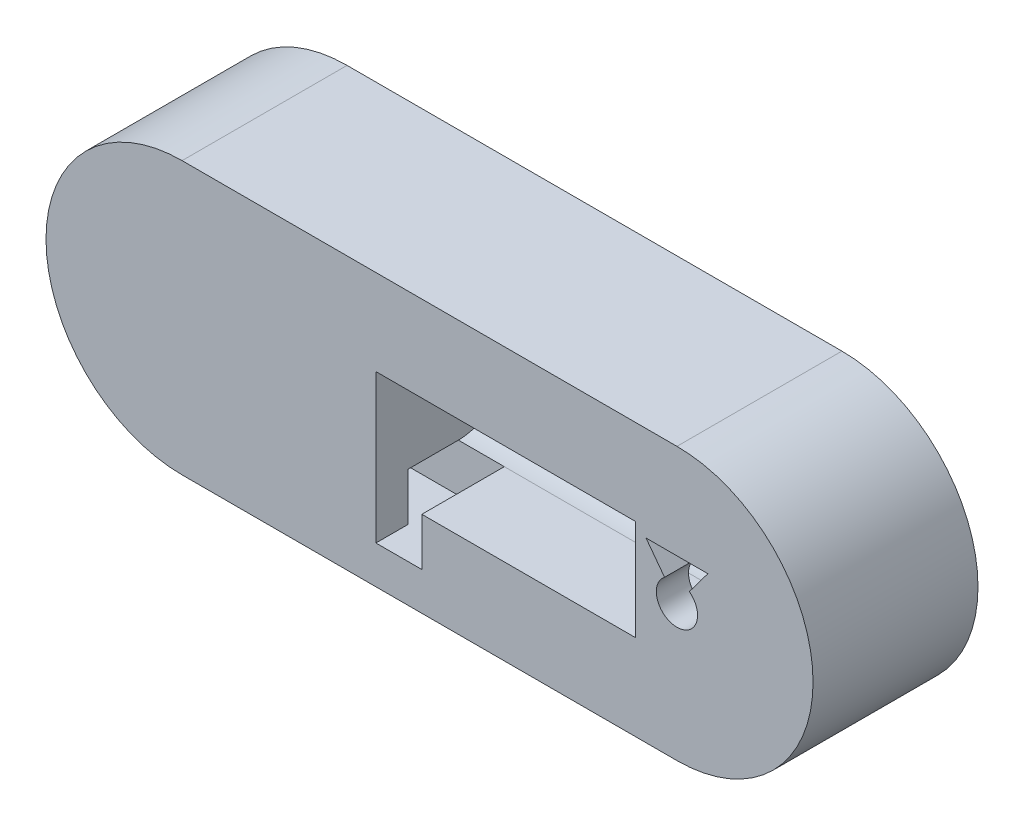
ISO-10303-21;
HEADER;
FILE_DESCRIPTION(('STEP AP214'),'2;1');
FILE_NAME('part.step','',(''),(''),'','','');
FILE_SCHEMA(('AUTOMOTIVE_DESIGN { 1 0 10303 214 1 1 1 1 }'));
ENDSEC;
DATA;
#1=APPLICATION_CONTEXT('core data for automotive mechanical design processes');
#2=APPLICATION_PROTOCOL_DEFINITION('international standard','automotive_design',2000,#1);
#3=PRODUCT_CONTEXT('',#1,'mechanical');
#4=PRODUCT('Part','Part','',(#3));
#5=PRODUCT_RELATED_PRODUCT_CATEGORY('part','',(#4));
#6=PRODUCT_DEFINITION_FORMATION('','',#4);
#7=PRODUCT_DEFINITION_CONTEXT('part definition',#1,'design');
#8=PRODUCT_DEFINITION('design','',#6,#7);
#9=PRODUCT_DEFINITION_SHAPE('','',#8);
#10=(LENGTH_UNIT() NAMED_UNIT(*) SI_UNIT(.MILLI.,.METRE.));
#11=(NAMED_UNIT(*) PLANE_ANGLE_UNIT() SI_UNIT($,.RADIAN.));
#12=(NAMED_UNIT(*) SI_UNIT($,.STERADIAN.) SOLID_ANGLE_UNIT());
#13=UNCERTAINTY_MEASURE_WITH_UNIT(LENGTH_MEASURE(1.E-05),#10,'distance_accuracy_value','');
#14=(GEOMETRIC_REPRESENTATION_CONTEXT(3) GLOBAL_UNCERTAINTY_ASSIGNED_CONTEXT((#13)) GLOBAL_UNIT_ASSIGNED_CONTEXT((#10,
#11,#12)) REPRESENTATION_CONTEXT('',''));
#15=CARTESIAN_POINT('',(0.,0.,0.));
#16=DIRECTION('',(0.,0.,1.));
#17=DIRECTION('',(1.,0.,0.));
#18=AXIS2_PLACEMENT_3D('',#15,#16,#17);
#19=CARTESIAN_POINT('',(3.97288903810641,0.,20.));
#20=DIRECTION('',(-1.,0.,0.));
#21=DIRECTION('',(0.,-1.,0.));
#22=AXIS2_PLACEMENT_3D('',#19,#20,#21);
#23=PLANE('',#22);
#24=DIRECTION('',(0.,0.,1.));
#25=VECTOR('',#24,1.);
#26=CARTESIAN_POINT('',(3.97288903810642,-12.2,0.));
#27=LINE('',#26,#25);
#28=CARTESIAN_POINT('',(3.97288903810642,-12.2,20.));
#29=VERTEX_POINT('',#28);
#30=CARTESIAN_POINT('',(3.97288903810642,-12.2,32.2));
#31=VERTEX_POINT('',#30);
#32=EDGE_CURVE('E260',#29,#31,#27,.T.);
#33=ORIENTED_EDGE('',*,*,#32,.F.);
#34=CARTESIAN_POINT('',(3.97288903810641,0.,20.));
#35=DIRECTION('',(1.,0.,0.));
#36=DIRECTION('',(0.,1.,0.));
#37=AXIS2_PLACEMENT_3D('',#34,#35,#36);
#38=CIRCLE('',#37,12.2);
#39=CARTESIAN_POINT('',(3.97288903810641,12.2,20.));
#40=VERTEX_POINT('',#39);
#41=EDGE_CURVE('E331',#29,#40,#38,.T.);
#42=ORIENTED_EDGE('',*,*,#41,.T.);
#43=DIRECTION('',(0.,0.,1.));
#44=VECTOR('',#43,1.);
#45=CARTESIAN_POINT('',(3.97288903810641,12.2,20.));
#46=LINE('',#45,#44);
#47=CARTESIAN_POINT('',(3.97288903810641,12.2,40.));
#48=VERTEX_POINT('',#47);
#49=EDGE_CURVE('E377',#40,#48,#46,.T.);
#50=ORIENTED_EDGE('',*,*,#49,.T.);
#51=DIRECTION('',(0.,-1.,0.));
#52=VECTOR('',#51,1.);
#53=CARTESIAN_POINT('',(3.97288903810641,0.,40.));
#54=LINE('',#53,#52);
#55=CARTESIAN_POINT('',(3.97288903810642,-23.8,40.));
#56=VERTEX_POINT('',#55);
#57=EDGE_CURVE('E356',#48,#56,#54,.T.);
#58=ORIENTED_EDGE('',*,*,#57,.T.);
#59=DIRECTION('',(0.,0.,1.));
#60=VECTOR('',#59,1.);
#61=CARTESIAN_POINT('',(3.97288903810642,-23.8,20.));
#62=LINE('',#61,#60);
#63=CARTESIAN_POINT('',(3.97288903810642,-23.8,32.2));
#64=VERTEX_POINT('',#63);
#65=EDGE_CURVE('E376',#64,#56,#62,.T.);
#66=ORIENTED_EDGE('',*,*,#65,.F.);
#67=DIRECTION('',(0.,-1.,0.));
#68=VECTOR('',#67,1.);
#69=CARTESIAN_POINT('',(3.97288903810641,0.,32.2));
#70=LINE('',#69,#68);
#71=EDGE_CURVE('E486',#31,#64,#70,.T.);
#72=ORIENTED_EDGE('',*,*,#71,.F.);
#73=EDGE_LOOP('',(#33,#42,#50,#58,#66,#72));
#74=FACE_BOUND('',#73,.T.);
#75=ADVANCED_FACE('F51',(#74),#23,.F.);
#76=CARTESIAN_POINT('',(76.9728890381064,0.,40.));
#77=DIRECTION('',(0.,0.,-1.));
#78=DIRECTION('',(-1.,0.,0.));
#79=AXIS2_PLACEMENT_3D('',#76,#77,#78);
#80=CYLINDRICAL_SURFACE('',#79,5.);
#81=DIRECTION('',(0.,0.,-1.));
#82=VECTOR('',#81,1.);
#83=CARTESIAN_POINT('',(73.9728890381064,4.,40.));
#84=LINE('',#83,#82);
#85=CARTESIAN_POINT('',(73.9728890381064,4.,7.80000000000001));
#86=VERTEX_POINT('',#85);
#87=CARTESIAN_POINT('',(73.9728890381064,4.,0.));
#88=VERTEX_POINT('',#87);
#89=EDGE_CURVE('E454',#86,#88,#84,.T.);
#90=ORIENTED_EDGE('',*,*,#89,.F.);
#91=CARTESIAN_POINT('',(76.9728890381064,0.,7.80000000000001));
#92=DIRECTION('',(0.,0.,1.));
#93=DIRECTION('',(1.,0.,0.));
#94=AXIS2_PLACEMENT_3D('',#91,#92,#93);
#95=CIRCLE('',#94,5.);
#96=CARTESIAN_POINT('',(79.9728890381064,4.,7.80000000000001));
#97=VERTEX_POINT('',#96);
#98=EDGE_CURVE('E325',#86,#97,#95,.T.);
#99=ORIENTED_EDGE('',*,*,#98,.T.);
#100=DIRECTION('',(0.,0.,-1.));
#101=VECTOR('',#100,1.);
#102=CARTESIAN_POINT('',(79.9728890381064,4.,40.));
#103=LINE('',#102,#101);
#104=CARTESIAN_POINT('',(79.9728890381064,4.,0.));
#105=VERTEX_POINT('',#104);
#106=EDGE_CURVE('E444',#97,#105,#103,.T.);
#107=ORIENTED_EDGE('',*,*,#106,.T.);
#108=CARTESIAN_POINT('',(76.9728890381064,0.,0.));
#109=DIRECTION('',(0.,0.,1.));
#110=DIRECTION('',(1.,0.,0.));
#111=AXIS2_PLACEMENT_3D('',#108,#109,#110);
#112=CIRCLE('',#111,5.);
#113=EDGE_CURVE('E427',#88,#105,#112,.T.);
#114=ORIENTED_EDGE('',*,*,#113,.F.);
#115=EDGE_LOOP('',(#90,#99,#107,#114));
#116=FACE_BOUND('',#115,.T.);
#117=ADVANCED_FACE('F557',(#116),#80,.F.);
#118=CARTESIAN_POINT('',(49.2626489843882,36.9469867382911,40.));
#119=DIRECTION('',(0.800000000000001,0.599999999999999,0.));
#120=DIRECTION('',(-0.599999999999999,0.800000000000001,0.));
#121=AXIS2_PLACEMENT_3D('',#118,#119,#120);
#122=PLANE('',#121);
#123=DIRECTION('',(0.,0.,-1.));
#124=VECTOR('',#123,1.);
#125=CARTESIAN_POINT('',(69.4728890381064,9.99999999999999,40.));
#126=LINE('',#125,#124);
#127=CARTESIAN_POINT('',(69.4728890381064,10.,7.80000000000001));
#128=VERTEX_POINT('',#127);
#129=CARTESIAN_POINT('',(69.4728890381064,9.99999999999999,0.));
#130=VERTEX_POINT('',#129);
#131=EDGE_CURVE('E446',#128,#130,#126,.T.);
#132=ORIENTED_EDGE('',*,*,#131,.F.);
#133=DIRECTION('',(0.599999999999999,-0.800000000000001,0.));
#134=VECTOR('',#133,1.);
#135=CARTESIAN_POINT('',(49.2626489843882,36.9469867382911,7.80000000000001));
#136=LINE('',#135,#134);
#137=EDGE_CURVE('E322',#128,#86,#136,.T.);
#138=ORIENTED_EDGE('',*,*,#137,.T.);
#139=ORIENTED_EDGE('',*,*,#89,.T.);
#140=DIRECTION('',(0.599999999999999,-0.800000000000001,0.));
#141=VECTOR('',#140,1.);
#142=CARTESIAN_POINT('',(49.2626489843882,36.9469867382911,0.));
#143=LINE('',#142,#141);
#144=EDGE_CURVE('E433',#130,#88,#143,.T.);
#145=ORIENTED_EDGE('',*,*,#144,.F.);
#146=EDGE_LOOP('',(#132,#138,#139,#145));
#147=FACE_BOUND('',#146,.T.);
#148=ADVANCED_FACE('F566',(#147),#122,.T.);
#149=CARTESIAN_POINT('',(0.,10.,40.));
#150=DIRECTION('',(0.,-1.,0.));
#151=DIRECTION('',(0.,0.,-1.));
#152=AXIS2_PLACEMENT_3D('',#149,#150,#151);
#153=PLANE('',#152);
#154=DIRECTION('',(0.,0.,-1.));
#155=VECTOR('',#154,1.);
#156=CARTESIAN_POINT('',(84.4728890381064,9.99999999999999,40.));
#157=LINE('',#156,#155);
#158=CARTESIAN_POINT('',(84.4728890381064,9.99999999999999,7.80000000000001));
#159=VERTEX_POINT('',#158);
#160=CARTESIAN_POINT('',(84.4728890381064,9.99999999999999,0.));
#161=VERTEX_POINT('',#160);
#162=EDGE_CURVE('E443',#159,#161,#157,.T.);
#163=ORIENTED_EDGE('',*,*,#162,.F.);
#164=DIRECTION('',(-1.,0.,0.));
#165=VECTOR('',#164,1.);
#166=CARTESIAN_POINT('',(0.,10.,7.80000000000001));
#167=LINE('',#166,#165);
#168=EDGE_CURVE('E316',#159,#128,#167,.T.);
#169=ORIENTED_EDGE('',*,*,#168,.T.);
#170=ORIENTED_EDGE('',*,*,#131,.T.);
#171=DIRECTION('',(-1.,0.,0.));
#172=VECTOR('',#171,1.);
#173=CARTESIAN_POINT('',(0.,10.,0.));
#174=LINE('',#173,#172);
#175=EDGE_CURVE('E436',#161,#130,#174,.T.);
#176=ORIENTED_EDGE('',*,*,#175,.F.);
#177=EDGE_LOOP('',(#163,#169,#170,#176));
#178=FACE_BOUND('',#177,.T.);
#179=ADVANCED_FACE('F603',(#178),#153,.T.);
#180=CARTESIAN_POINT('',(49.2626489843881,-36.9469867382911,40.));
#181=DIRECTION('',(-0.8,0.6,0.));
#182=DIRECTION('',(-0.6,-0.8,0.));
#183=AXIS2_PLACEMENT_3D('',#180,#181,#182);
#184=PLANE('',#183);
#185=ORIENTED_EDGE('',*,*,#106,.F.);
#186=DIRECTION('',(0.6,0.8,0.));
#187=VECTOR('',#186,1.);
#188=CARTESIAN_POINT('',(49.2626489843881,-36.9469867382911,7.80000000000001));
#189=LINE('',#188,#187);
#190=EDGE_CURVE('E309',#97,#159,#189,.T.);
#191=ORIENTED_EDGE('',*,*,#190,.T.);
#192=ORIENTED_EDGE('',*,*,#162,.T.);
#193=DIRECTION('',(0.6,0.8,0.));
#194=VECTOR('',#193,1.);
#195=CARTESIAN_POINT('',(49.2626489843881,-36.9469867382911,0.));
#196=LINE('',#195,#194);
#197=EDGE_CURVE('E396',#105,#161,#196,.T.);
#198=ORIENTED_EDGE('',*,*,#197,.F.);
#199=EDGE_LOOP('',(#185,#191,#192,#198));
#200=FACE_BOUND('',#199,.T.);
#201=ADVANCED_FACE('F577',(#200),#184,.T.);
#202=CARTESIAN_POINT('',(66.9728890381064,0.,20.));
#203=DIRECTION('',(1.,0.,0.));
#204=DIRECTION('',(0.,0.,-1.));
#205=AXIS2_PLACEMENT_3D('',#202,#203,#204);
#206=PLANE('',#205);
#207=DIRECTION('',(0.,1.,0.));
#208=VECTOR('',#207,1.);
#209=CARTESIAN_POINT('',(66.9728890381064,0.,32.2));
#210=LINE('',#209,#208);
#211=CARTESIAN_POINT('',(66.9728890381064,-12.2,32.2));
#212=VERTEX_POINT('',#211);
#213=CARTESIAN_POINT('',(66.9728890381064,12.2,32.2));
#214=VERTEX_POINT('',#213);
#215=EDGE_CURVE('E299',#212,#214,#210,.T.);
#216=ORIENTED_EDGE('',*,*,#215,.F.);
#217=DIRECTION('',(0.,0.,1.));
#218=VECTOR('',#217,1.);
#219=CARTESIAN_POINT('',(66.9728890381064,-12.2,20.));
#220=LINE('',#219,#218);
#221=CARTESIAN_POINT('',(66.9728890381064,-12.2,40.));
#222=VERTEX_POINT('',#221);
#223=EDGE_CURVE('E367',#212,#222,#220,.T.);
#224=ORIENTED_EDGE('',*,*,#223,.T.);
#225=DIRECTION('',(0.,1.,0.));
#226=VECTOR('',#225,1.);
#227=CARTESIAN_POINT('',(66.9728890381064,0.,40.));
#228=LINE('',#227,#226);
#229=CARTESIAN_POINT('',(66.9728890381064,12.2,40.));
#230=VERTEX_POINT('',#229);
#231=EDGE_CURVE('E336',#222,#230,#228,.T.);
#232=ORIENTED_EDGE('',*,*,#231,.T.);
#233=DIRECTION('',(0.,0.,1.));
#234=VECTOR('',#233,1.);
#235=CARTESIAN_POINT('',(66.9728890381064,12.2,20.));
#236=LINE('',#235,#234);
#237=EDGE_CURVE('E355',#214,#230,#236,.T.);
#238=ORIENTED_EDGE('',*,*,#237,.F.);
#239=EDGE_LOOP('',(#216,#224,#232,#238));
#240=FACE_BOUND('',#239,.T.);
#241=ADVANCED_FACE('F526',(#240),#206,.F.);
#242=CARTESIAN_POINT('',(0.,0.,20.));
#243=DIRECTION('',(0.,0.,1.));
#244=DIRECTION('',(1.,0.,0.));
#245=AXIS2_PLACEMENT_3D('',#242,#243,#244);
#246=PLANE('',#245);
#247=DIRECTION('',(0.,1.,0.));
#248=VECTOR('',#247,1.);
#249=CARTESIAN_POINT('',(-34.4271109618936,0.,20.));
#250=LINE('',#249,#248);
#251=CARTESIAN_POINT('',(-34.4271109618936,-23.8,20.));
#252=VERTEX_POINT('',#251);
#253=CARTESIAN_POINT('',(-34.4271109618936,-12.2,20.));
#254=VERTEX_POINT('',#253);
#255=EDGE_CURVE('E252',#252,#254,#250,.T.);
#256=ORIENTED_EDGE('',*,*,#255,.F.);
#257=DIRECTION('',(1.,0.,0.));
#258=VECTOR('',#257,1.);
#259=CARTESIAN_POINT('',(0.,-23.8,20.));
#260=LINE('',#259,#258);
#261=CARTESIAN_POINT('',(15.1104475181307,-23.8,20.));
#262=VERTEX_POINT('',#261);
#263=EDGE_CURVE('E343',#252,#262,#260,.T.);
#264=ORIENTED_EDGE('',*,*,#263,.T.);
#265=DIRECTION('',(0.,1.,0.));
#266=VECTOR('',#265,1.);
#267=CARTESIAN_POINT('',(15.1104475181307,0.,20.));
#268=LINE('',#267,#266);
#269=CARTESIAN_POINT('',(15.1104475181307,-12.2,20.));
#270=VERTEX_POINT('',#269);
#271=EDGE_CURVE('E350',#262,#270,#268,.T.);
#272=ORIENTED_EDGE('',*,*,#271,.T.);
#273=DIRECTION('',(-1.,0.,0.));
#274=VECTOR('',#273,1.);
#275=CARTESIAN_POINT('',(107.373384084578,-12.2,20.));
#276=LINE('',#275,#274);
#277=EDGE_CURVE('E272',#270,#29,#276,.T.);
#278=ORIENTED_EDGE('',*,*,#277,.T.);
#279=DIRECTION('',(1.,0.,0.));
#280=VECTOR('',#279,1.);
#281=CARTESIAN_POINT('',(-46.0271109618936,-12.2,20.));
#282=LINE('',#281,#280);
#283=EDGE_CURVE('E261',#254,#29,#282,.T.);
#284=ORIENTED_EDGE('',*,*,#283,.F.);
#285=EDGE_LOOP('',(#256,#264,#272,#278,#284));
#286=FACE_BOUND('',#285,.T.);
#287=ADVANCED_FACE('F269',(#286),#246,.T.);
#288=CARTESIAN_POINT('',(0.,0.,0.));
#289=DIRECTION('',(0.,0.,1.));
#290=DIRECTION('',(1.,0.,0.));
#291=AXIS2_PLACEMENT_3D('',#288,#289,#290);
#292=PLANE('',#291);
#293=DIRECTION('',(1.,0.,0.));
#294=VECTOR('',#293,1.);
#295=CARTESIAN_POINT('',(0.,-12.2,0.));
#296=LINE('',#295,#294);
#297=CARTESIAN_POINT('',(-56.0271109618936,-12.2,0.));
#298=VERTEX_POINT('',#297);
#299=CARTESIAN_POINT('',(-34.4271109618936,-12.2,0.));
#300=VERTEX_POINT('',#299);
#301=EDGE_CURVE('E70',#298,#300,#296,.T.);
#302=ORIENTED_EDGE('',*,*,#301,.F.);
#303=DIRECTION('',(0.,-1.,0.));
#304=VECTOR('',#303,1.);
#305=CARTESIAN_POINT('',(-56.0271109618936,-23.8,0.));
#306=LINE('',#305,#304);
#307=CARTESIAN_POINT('',(-56.0271109618936,-23.8,0.));
#308=VERTEX_POINT('',#307);
#309=EDGE_CURVE('E472',#298,#308,#306,.T.);
#310=ORIENTED_EDGE('',*,*,#309,.T.);
#311=DIRECTION('',(-1.,0.,0.));
#312=VECTOR('',#311,1.);
#313=CARTESIAN_POINT('',(0.,-23.7999999999999,0.));
#314=LINE('',#313,#312);
#315=CARTESIAN_POINT('',(-34.4271109618936,-23.8,0.));
#316=VERTEX_POINT('',#315);
#317=EDGE_CURVE('E74',#316,#308,#314,.T.);
#318=ORIENTED_EDGE('',*,*,#317,.F.);
#319=DIRECTION('',(0.,1.,0.));
#320=VECTOR('',#319,1.);
#321=CARTESIAN_POINT('',(-34.4271109618936,0.,0.));
#322=LINE('',#321,#320);
#323=EDGE_CURVE('E267',#316,#300,#322,.T.);
#324=ORIENTED_EDGE('',*,*,#323,.T.);
#325=EDGE_LOOP('',(#302,#310,#318,#324));
#326=FACE_BOUND('',#325,.T.);
#327=CARTESIAN_POINT('',(-43.0271109618936,0.,0.));
#328=DIRECTION('',(0.,0.,1.));
#329=DIRECTION('',(1.,0.,0.));
#330=AXIS2_PLACEMENT_3D('',#327,#328,#329);
#331=CIRCLE('',#330,33.);
#332=CARTESIAN_POINT('',(-43.0271109618936,33.,0.));
#333=VERTEX_POINT('',#332);
#334=CARTESIAN_POINT('',(-43.0271109618936,-33.,0.));
#335=VERTEX_POINT('',#334);
#336=EDGE_CURVE('E393',#333,#335,#331,.T.);
#337=ORIENTED_EDGE('',*,*,#336,.F.);
#338=DIRECTION('',(1.,0.,0.));
#339=VECTOR('',#338,1.);
#340=CARTESIAN_POINT('',(0.,33.,0.));
#341=LINE('',#340,#339);
#342=CARTESIAN_POINT('',(76.9728890381064,33.,0.));
#343=VERTEX_POINT('',#342);
#344=EDGE_CURVE('E430',#333,#343,#341,.T.);
#345=ORIENTED_EDGE('',*,*,#344,.T.);
#346=CARTESIAN_POINT('',(76.9728890381064,0.,0.));
#347=DIRECTION('',(0.,0.,1.));
#348=DIRECTION('',(1.,0.,0.));
#349=AXIS2_PLACEMENT_3D('',#346,#347,#348);
#350=CIRCLE('',#349,33.);
#351=CARTESIAN_POINT('',(76.9728890381064,-33.,0.));
#352=VERTEX_POINT('',#351);
#353=EDGE_CURVE('E425',#352,#343,#350,.T.);
#354=ORIENTED_EDGE('',*,*,#353,.F.);
#355=DIRECTION('',(1.,0.,0.));
#356=VECTOR('',#355,1.);
#357=CARTESIAN_POINT('',(0.,-33.,0.));
#358=LINE('',#357,#356);
#359=EDGE_CURVE('E422',#335,#352,#358,.T.);
#360=ORIENTED_EDGE('',*,*,#359,.F.);
#361=EDGE_LOOP('',(#337,#345,#354,#360));
#362=FACE_BOUND('',#361,.T.);
#363=ORIENTED_EDGE('',*,*,#113,.T.);
#364=ORIENTED_EDGE('',*,*,#197,.T.);
#365=ORIENTED_EDGE('',*,*,#175,.T.);
#366=ORIENTED_EDGE('',*,*,#144,.T.);
#367=EDGE_LOOP('',(#363,#364,#365,#366));
#368=FACE_BOUND('',#367,.T.);
#369=CARTESIAN_POINT('',(-43.0271109618936,0.,0.));
#370=DIRECTION('',(0.,0.,1.));
#371=DIRECTION('',(1.,0.,0.));
#372=AXIS2_PLACEMENT_3D('',#369,#370,#371);
#373=CIRCLE('',#372,5.);
#374=CARTESIAN_POINT('',(-39.2340584549536,3.25772200772199,0.));
#375=VERTEX_POINT('',#374);
#376=CARTESIAN_POINT('',(-39.2340584549536,-3.25772200772199,0.));
#377=VERTEX_POINT('',#376);
#378=EDGE_CURVE('E383',#375,#377,#373,.T.);
#379=ORIENTED_EDGE('',*,*,#378,.T.);
#380=DIRECTION('',(0.,-1.,0.));
#381=VECTOR('',#380,1.);
#382=CARTESIAN_POINT('',(-39.2340584549536,0.,0.));
#383=LINE('',#382,#381);
#384=EDGE_CURVE('E371',#375,#377,#383,.T.);
#385=ORIENTED_EDGE('',*,*,#384,.F.);
#386=EDGE_LOOP('',(#379,#385));
#387=FACE_BOUND('',#386,.T.);
#388=ADVANCED_FACE('F478',(#326,#362,#368,#387),#292,.F.);
#389=CARTESIAN_POINT('',(76.9728890381064,0.,32.2));
#390=DIRECTION('',(0.,0.,1.));
#391=DIRECTION('',(1.,0.,0.));
#392=AXIS2_PLACEMENT_3D('',#389,#390,#391);
#393=CIRCLE('',#392,5.);
#394=CARTESIAN_POINT('',(73.9728890381064,4.,32.2));
#395=VERTEX_POINT('',#394);
#396=CARTESIAN_POINT('',(79.9728890381064,4.,32.2));
#397=VERTEX_POINT('',#396);
#398=EDGE_CURVE('E335',#395,#397,#393,.T.);
#399=ORIENTED_EDGE('',*,*,#398,.F.);
#400=CARTESIAN_POINT('',(73.9728890381064,4.,40.));
#401=VERTEX_POINT('',#400);
#402=EDGE_CURVE('E453',#401,#395,#84,.T.);
#403=ORIENTED_EDGE('',*,*,#402,.F.);
#404=CARTESIAN_POINT('',(76.9728890381064,0.,40.));
#405=DIRECTION('',(0.,0.,1.));
#406=DIRECTION('',(1.,0.,0.));
#407=AXIS2_PLACEMENT_3D('',#404,#405,#406);
#408=CIRCLE('',#407,5.);
#409=CARTESIAN_POINT('',(79.9728890381064,4.,40.));
#410=VERTEX_POINT('',#409);
#411=EDGE_CURVE('E407',#401,#410,#408,.T.);
#412=ORIENTED_EDGE('',*,*,#411,.T.);
#413=EDGE_CURVE('E441',#410,#397,#103,.T.);
#414=ORIENTED_EDGE('',*,*,#413,.T.);
#415=EDGE_LOOP('',(#399,#403,#412,#414));
#416=FACE_BOUND('',#415,.T.);
#417=ADVANCED_FACE('F567',(#416),#80,.F.);
#418=DIRECTION('',(0.599999999999999,-0.800000000000001,0.));
#419=VECTOR('',#418,1.);
#420=CARTESIAN_POINT('',(49.2626489843882,36.9469867382911,32.2));
#421=LINE('',#420,#419);
#422=CARTESIAN_POINT('',(69.4728890381064,10.,32.2));
#423=VERTEX_POINT('',#422);
#424=EDGE_CURVE('E328',#423,#395,#421,.T.);
#425=ORIENTED_EDGE('',*,*,#424,.F.);
#426=CARTESIAN_POINT('',(69.4728890381064,9.99999999999999,40.));
#427=VERTEX_POINT('',#426);
#428=EDGE_CURVE('E448',#427,#423,#126,.T.);
#429=ORIENTED_EDGE('',*,*,#428,.F.);
#430=DIRECTION('',(0.599999999999999,-0.800000000000001,0.));
#431=VECTOR('',#430,1.);
#432=CARTESIAN_POINT('',(49.2626489843882,36.9469867382911,40.));
#433=LINE('',#432,#431);
#434=EDGE_CURVE('E410',#427,#401,#433,.T.);
#435=ORIENTED_EDGE('',*,*,#434,.T.);
#436=ORIENTED_EDGE('',*,*,#402,.T.);
#437=EDGE_LOOP('',(#425,#429,#435,#436));
#438=FACE_BOUND('',#437,.T.);
#439=ADVANCED_FACE('F602',(#438),#122,.T.);
#440=DIRECTION('',(-1.,0.,0.));
#441=VECTOR('',#440,1.);
#442=CARTESIAN_POINT('',(0.,10.,32.2));
#443=LINE('',#442,#441);
#444=CARTESIAN_POINT('',(84.4728890381064,9.99999999999999,32.2));
#445=VERTEX_POINT('',#444);
#446=EDGE_CURVE('E329',#445,#423,#443,.T.);
#447=ORIENTED_EDGE('',*,*,#446,.F.);
#448=CARTESIAN_POINT('',(84.4728890381064,9.99999999999999,40.));
#449=VERTEX_POINT('',#448);
#450=EDGE_CURVE('E447',#449,#445,#157,.T.);
#451=ORIENTED_EDGE('',*,*,#450,.F.);
#452=DIRECTION('',(-1.,0.,0.));
#453=VECTOR('',#452,1.);
#454=CARTESIAN_POINT('',(0.,10.,40.));
#455=LINE('',#454,#453);
#456=EDGE_CURVE('E414',#449,#427,#455,.T.);
#457=ORIENTED_EDGE('',*,*,#456,.T.);
#458=ORIENTED_EDGE('',*,*,#428,.T.);
#459=EDGE_LOOP('',(#447,#451,#457,#458));
#460=FACE_BOUND('',#459,.T.);
#461=ADVANCED_FACE('F596',(#460),#153,.T.);
#462=CARTESIAN_POINT('',(-43.0271109618936,0.,40.));
#463=DIRECTION('',(0.,0.,-1.));
#464=DIRECTION('',(-1.,0.,0.));
#465=AXIS2_PLACEMENT_3D('',#462,#463,#464);
#466=CYLINDRICAL_SURFACE('',#465,33.);
#467=ORIENTED_EDGE('',*,*,#336,.T.);
#468=DIRECTION('',(0.,0.,-1.));
#469=VECTOR('',#468,1.);
#470=CARTESIAN_POINT('',(-43.0271109618936,-33.,40.));
#471=LINE('',#470,#469);
#472=CARTESIAN_POINT('',(-43.0271109618936,-33.,40.));
#473=VERTEX_POINT('',#472);
#474=EDGE_CURVE('E463',#473,#335,#471,.T.);
#475=ORIENTED_EDGE('',*,*,#474,.F.);
#476=CARTESIAN_POINT('',(-43.0271109618936,0.,40.));
#477=DIRECTION('',(0.,0.,1.));
#478=DIRECTION('',(1.,0.,0.));
#479=AXIS2_PLACEMENT_3D('',#476,#477,#478);
#480=CIRCLE('',#479,33.);
#481=CARTESIAN_POINT('',(-43.0271109618936,33.,40.));
#482=VERTEX_POINT('',#481);
#483=EDGE_CURVE('E397',#482,#473,#480,.T.);
#484=ORIENTED_EDGE('',*,*,#483,.F.);
#485=DIRECTION('',(0.,0.,-1.));
#486=VECTOR('',#485,1.);
#487=CARTESIAN_POINT('',(-43.0271109618936,33.,40.));
#488=LINE('',#487,#486);
#489=EDGE_CURVE('E419',#482,#333,#488,.T.);
#490=ORIENTED_EDGE('',*,*,#489,.T.);
#491=EDGE_LOOP('',(#467,#475,#484,#490));
#492=FACE_BOUND('',#491,.T.);
#493=ADVANCED_FACE('F601',(#492),#466,.T.);
#494=CARTESIAN_POINT('',(0.,-33.,40.));
#495=DIRECTION('',(0.,1.,0.));
#496=DIRECTION('',(0.,0.,1.));
#497=AXIS2_PLACEMENT_3D('',#494,#495,#496);
#498=PLANE('',#497);
#499=ORIENTED_EDGE('',*,*,#359,.T.);
#500=DIRECTION('',(0.,0.,-1.));
#501=VECTOR('',#500,1.);
#502=CARTESIAN_POINT('',(76.9728890381064,-33.,40.));
#503=LINE('',#502,#501);
#504=CARTESIAN_POINT('',(76.9728890381064,-33.,40.));
#505=VERTEX_POINT('',#504);
#506=EDGE_CURVE('E458',#505,#352,#503,.T.);
#507=ORIENTED_EDGE('',*,*,#506,.F.);
#508=DIRECTION('',(1.,0.,0.));
#509=VECTOR('',#508,1.);
#510=CARTESIAN_POINT('',(0.,-33.,40.));
#511=LINE('',#510,#509);
#512=EDGE_CURVE('E399',#473,#505,#511,.T.);
#513=ORIENTED_EDGE('',*,*,#512,.F.);
#514=ORIENTED_EDGE('',*,*,#474,.T.);
#515=EDGE_LOOP('',(#499,#507,#513,#514));
#516=FACE_BOUND('',#515,.T.);
#517=ADVANCED_FACE('F618',(#516),#498,.F.);
#518=CARTESIAN_POINT('',(76.9728890381064,0.,40.));
#519=DIRECTION('',(0.,0.,-1.));
#520=DIRECTION('',(-1.,0.,0.));
#521=AXIS2_PLACEMENT_3D('',#518,#519,#520);
#522=CYLINDRICAL_SURFACE('',#521,33.);
#523=ORIENTED_EDGE('',*,*,#353,.T.);
#524=DIRECTION('',(0.,0.,-1.));
#525=VECTOR('',#524,1.);
#526=CARTESIAN_POINT('',(76.9728890381064,33.,40.));
#527=LINE('',#526,#525);
#528=CARTESIAN_POINT('',(76.9728890381064,33.,40.));
#529=VERTEX_POINT('',#528);
#530=EDGE_CURVE('E459',#529,#343,#527,.T.);
#531=ORIENTED_EDGE('',*,*,#530,.F.);
#532=CARTESIAN_POINT('',(76.9728890381064,0.,40.));
#533=DIRECTION('',(0.,0.,1.));
#534=DIRECTION('',(1.,0.,0.));
#535=AXIS2_PLACEMENT_3D('',#532,#533,#534);
#536=CIRCLE('',#535,33.);
#537=EDGE_CURVE('E405',#505,#529,#536,.T.);
#538=ORIENTED_EDGE('',*,*,#537,.F.);
#539=ORIENTED_EDGE('',*,*,#506,.T.);
#540=EDGE_LOOP('',(#523,#531,#538,#539));
#541=FACE_BOUND('',#540,.T.);
#542=ADVANCED_FACE('F615',(#541),#522,.T.);
#543=CARTESIAN_POINT('',(0.,33.,40.));
#544=DIRECTION('',(0.,1.,0.));
#545=DIRECTION('',(0.,0.,1.));
#546=AXIS2_PLACEMENT_3D('',#543,#544,#545);
#547=PLANE('',#546);
#548=ORIENTED_EDGE('',*,*,#344,.F.);
#549=ORIENTED_EDGE('',*,*,#489,.F.);
#550=DIRECTION('',(1.,0.,0.));
#551=VECTOR('',#550,1.);
#552=CARTESIAN_POINT('',(0.,33.,40.));
#553=LINE('',#552,#551);
#554=EDGE_CURVE('E404',#482,#529,#553,.T.);
#555=ORIENTED_EDGE('',*,*,#554,.T.);
#556=ORIENTED_EDGE('',*,*,#530,.T.);
#557=EDGE_LOOP('',(#548,#549,#555,#556));
#558=FACE_BOUND('',#557,.T.);
#559=ADVANCED_FACE('F597',(#558),#547,.T.);
#560=DIRECTION('',(0.6,0.8,0.));
#561=VECTOR('',#560,1.);
#562=CARTESIAN_POINT('',(49.2626489843881,-36.9469867382911,32.2));
#563=LINE('',#562,#561);
#564=EDGE_CURVE('E470',#397,#445,#563,.T.);
#565=ORIENTED_EDGE('',*,*,#564,.F.);
#566=ORIENTED_EDGE('',*,*,#413,.F.);
#567=DIRECTION('',(0.6,0.8,0.));
#568=VECTOR('',#567,1.);
#569=CARTESIAN_POINT('',(49.2626489843881,-36.9469867382911,40.));
#570=LINE('',#569,#568);
#571=EDGE_CURVE('E417',#410,#449,#570,.T.);
#572=ORIENTED_EDGE('',*,*,#571,.T.);
#573=ORIENTED_EDGE('',*,*,#450,.T.);
#574=EDGE_LOOP('',(#565,#566,#572,#573));
#575=FACE_BOUND('',#574,.T.);
#576=ADVANCED_FACE('F592',(#575),#184,.T.);
#577=CARTESIAN_POINT('',(0.,0.,40.));
#578=DIRECTION('',(0.,0.,1.));
#579=DIRECTION('',(1.,0.,0.));
#580=AXIS2_PLACEMENT_3D('',#577,#578,#579);
#581=PLANE('',#580);
#582=ORIENTED_EDGE('',*,*,#231,.F.);
#583=DIRECTION('',(1.,0.,0.));
#584=VECTOR('',#583,1.);
#585=CARTESIAN_POINT('',(0.,-12.2,40.));
#586=LINE('',#585,#584);
#587=CARTESIAN_POINT('',(15.1104475181307,-12.2,40.));
#588=VERTEX_POINT('',#587);
#589=EDGE_CURVE('E345',#588,#222,#586,.T.);
#590=ORIENTED_EDGE('',*,*,#589,.F.);
#591=DIRECTION('',(0.,1.,0.));
#592=VECTOR('',#591,1.);
#593=CARTESIAN_POINT('',(15.1104475181307,0.,40.));
#594=LINE('',#593,#592);
#595=CARTESIAN_POINT('',(15.1104475181307,-23.8,40.));
#596=VERTEX_POINT('',#595);
#597=EDGE_CURVE('E364',#596,#588,#594,.T.);
#598=ORIENTED_EDGE('',*,*,#597,.F.);
#599=DIRECTION('',(1.,0.,0.));
#600=VECTOR('',#599,1.);
#601=CARTESIAN_POINT('',(0.,-23.8,40.));
#602=LINE('',#601,#600);
#603=EDGE_CURVE('E363',#56,#596,#602,.T.);
#604=ORIENTED_EDGE('',*,*,#603,.F.);
#605=ORIENTED_EDGE('',*,*,#57,.F.);
#606=DIRECTION('',(-1.,0.,0.));
#607=VECTOR('',#606,1.);
#608=CARTESIAN_POINT('',(0.,12.2,40.));
#609=LINE('',#608,#607);
#610=EDGE_CURVE('E351',#230,#48,#609,.T.);
#611=ORIENTED_EDGE('',*,*,#610,.F.);
#612=EDGE_LOOP('',(#582,#590,#598,#604,#605,#611));
#613=FACE_BOUND('',#612,.T.);
#614=ORIENTED_EDGE('',*,*,#483,.T.);
#615=ORIENTED_EDGE('',*,*,#512,.T.);
#616=ORIENTED_EDGE('',*,*,#537,.T.);
#617=ORIENTED_EDGE('',*,*,#554,.F.);
#618=EDGE_LOOP('',(#614,#615,#616,#617));
#619=FACE_BOUND('',#618,.T.);
#620=ORIENTED_EDGE('',*,*,#411,.F.);
#621=ORIENTED_EDGE('',*,*,#434,.F.);
#622=ORIENTED_EDGE('',*,*,#456,.F.);
#623=ORIENTED_EDGE('',*,*,#571,.F.);
#624=EDGE_LOOP('',(#620,#621,#622,#623));
#625=FACE_BOUND('',#624,.T.);
#626=ADVANCED_FACE('F507',(#613,#619,#625),#581,.T.);
#627=CARTESIAN_POINT('',(-39.2340584549536,0.,10.));
#628=DIRECTION('',(1.,0.,0.));
#629=DIRECTION('',(0.,0.,-1.));
#630=AXIS2_PLACEMENT_3D('',#627,#628,#629);
#631=PLANE('',#630);
#632=ORIENTED_EDGE('',*,*,#384,.T.);
#633=DIRECTION('',(0.,0.,-1.));
#634=VECTOR('',#633,1.);
#635=CARTESIAN_POINT('',(-39.2340584549536,-3.25772200772199,10.));
#636=LINE('',#635,#634);
#637=CARTESIAN_POINT('',(-39.2340584549536,-3.25772200772199,10.));
#638=VERTEX_POINT('',#637);
#639=EDGE_CURVE('E387',#638,#377,#636,.T.);
#640=ORIENTED_EDGE('',*,*,#639,.F.);
#641=DIRECTION('',(0.,-1.,0.));
#642=VECTOR('',#641,1.);
#643=CARTESIAN_POINT('',(-39.2340584549536,0.,10.));
#644=LINE('',#643,#642);
#645=CARTESIAN_POINT('',(-39.2340584549536,3.25772200772199,10.));
#646=VERTEX_POINT('',#645);
#647=EDGE_CURVE('E382',#646,#638,#644,.T.);
#648=ORIENTED_EDGE('',*,*,#647,.F.);
#649=DIRECTION('',(0.,0.,-1.));
#650=VECTOR('',#649,1.);
#651=CARTESIAN_POINT('',(-39.2340584549536,3.25772200772199,10.));
#652=LINE('',#651,#650);
#653=EDGE_CURVE('E394',#646,#375,#652,.T.);
#654=ORIENTED_EDGE('',*,*,#653,.T.);
#655=EDGE_LOOP('',(#632,#640,#648,#654));
#656=FACE_BOUND('',#655,.T.);
#657=ADVANCED_FACE('F583',(#656),#631,.F.);
#658=CARTESIAN_POINT('',(-43.0271109618936,0.,10.));
#659=DIRECTION('',(0.,0.,-1.));
#660=DIRECTION('',(-1.,0.,0.));
#661=AXIS2_PLACEMENT_3D('',#658,#659,#660);
#662=CYLINDRICAL_SURFACE('',#661,5.);
#663=ORIENTED_EDGE('',*,*,#378,.F.);
#664=ORIENTED_EDGE('',*,*,#653,.F.);
#665=CARTESIAN_POINT('',(-43.0271109618936,0.,10.));
#666=DIRECTION('',(0.,0.,1.));
#667=DIRECTION('',(1.,0.,0.));
#668=AXIS2_PLACEMENT_3D('',#665,#666,#667);
#669=CIRCLE('',#668,5.);
#670=EDGE_CURVE('E381',#646,#638,#669,.T.);
#671=ORIENTED_EDGE('',*,*,#670,.T.);
#672=ORIENTED_EDGE('',*,*,#639,.T.);
#673=EDGE_LOOP('',(#663,#664,#671,#672));
#674=FACE_BOUND('',#673,.T.);
#675=ADVANCED_FACE('F578',(#674),#662,.F.);
#676=CARTESIAN_POINT('',(0.,0.,10.));
#677=DIRECTION('',(0.,0.,1.));
#678=DIRECTION('',(1.,0.,0.));
#679=AXIS2_PLACEMENT_3D('',#676,#677,#678);
#680=PLANE('',#679);
#681=ORIENTED_EDGE('',*,*,#647,.T.);
#682=ORIENTED_EDGE('',*,*,#670,.F.);
#683=EDGE_LOOP('',(#681,#682));
#684=FACE_BOUND('',#683,.T.);
#685=ADVANCED_FACE('F580',(#684),#680,.F.);
#686=CARTESIAN_POINT('',(0.,-12.2,20.));
#687=DIRECTION('',(0.,-1.,0.));
#688=DIRECTION('',(0.,0.,-1.));
#689=AXIS2_PLACEMENT_3D('',#686,#687,#688);
#690=PLANE('',#689);
#691=ORIENTED_EDGE('',*,*,#589,.T.);
#692=ORIENTED_EDGE('',*,*,#223,.F.);
#693=DIRECTION('',(-1.,0.,0.));
#694=VECTOR('',#693,1.);
#695=CARTESIAN_POINT('',(96.9728890381064,-12.2,32.2));
#696=LINE('',#695,#694);
#697=CARTESIAN_POINT('',(96.9728890381064,-12.2,32.2));
#698=VERTEX_POINT('',#697);
#699=EDGE_CURVE('E294',#698,#212,#696,.T.);
#700=ORIENTED_EDGE('',*,*,#699,.F.);
#701=DIRECTION('',(0.,0.,1.));
#702=VECTOR('',#701,1.);
#703=CARTESIAN_POINT('',(96.9728890381064,-12.2,0.));
#704=LINE('',#703,#702);
#705=CARTESIAN_POINT('',(96.9728890381064,-12.2,7.80000000000001));
#706=VERTEX_POINT('',#705);
#707=EDGE_CURVE('E284',#706,#698,#704,.T.);
#708=ORIENTED_EDGE('',*,*,#707,.F.);
#709=DIRECTION('',(-1.,0.,0.));
#710=VECTOR('',#709,1.);
#711=CARTESIAN_POINT('',(96.9728890381064,-12.2,7.80000000000001));
#712=LINE('',#711,#710);
#713=CARTESIAN_POINT('',(66.9728890381064,-12.2,7.80000000000001));
#714=VERTEX_POINT('',#713);
#715=EDGE_CURVE('E308',#706,#714,#712,.T.);
#716=ORIENTED_EDGE('',*,*,#715,.T.);
#717=DIRECTION('',(0.,0.,1.));
#718=VECTOR('',#717,1.);
#719=CARTESIAN_POINT('',(66.9728890381064,-12.2,0.));
#720=LINE('',#719,#718);
#721=CARTESIAN_POINT('',(66.9728890381064,-12.2,20.));
#722=VERTEX_POINT('',#721);
#723=EDGE_CURVE('E298',#714,#722,#720,.T.);
#724=ORIENTED_EDGE('',*,*,#723,.T.);
#725=DIRECTION('',(1.,0.,0.));
#726=VECTOR('',#725,1.);
#727=CARTESIAN_POINT('',(0.,-12.2,20.));
#728=LINE('',#727,#726);
#729=EDGE_CURVE('E346',#270,#722,#728,.T.);
#730=ORIENTED_EDGE('',*,*,#729,.F.);
#731=DIRECTION('',(0.,0.,1.));
#732=VECTOR('',#731,1.);
#733=CARTESIAN_POINT('',(15.1104475181307,-12.2,20.));
#734=LINE('',#733,#732);
#735=EDGE_CURVE('E375',#270,#588,#734,.T.);
#736=ORIENTED_EDGE('',*,*,#735,.T.);
#737=EDGE_LOOP('',(#691,#692,#700,#708,#716,#724,#730,#736));
#738=FACE_BOUND('',#737,.T.);
#739=ADVANCED_FACE('F519',(#738),#690,.F.);
#740=CARTESIAN_POINT('',(15.1104475181307,0.,20.));
#741=DIRECTION('',(1.,0.,0.));
#742=DIRECTION('',(0.,0.,-1.));
#743=AXIS2_PLACEMENT_3D('',#740,#741,#742);
#744=PLANE('',#743);
#745=ORIENTED_EDGE('',*,*,#597,.T.);
#746=ORIENTED_EDGE('',*,*,#735,.F.);
#747=ORIENTED_EDGE('',*,*,#271,.F.);
#748=DIRECTION('',(0.,0.,1.));
#749=VECTOR('',#748,1.);
#750=CARTESIAN_POINT('',(15.1104475181307,-23.8,20.));
#751=LINE('',#750,#749);
#752=EDGE_CURVE('E372',#262,#596,#751,.T.);
#753=ORIENTED_EDGE('',*,*,#752,.T.);
#754=EDGE_LOOP('',(#745,#746,#747,#753));
#755=FACE_BOUND('',#754,.T.);
#756=ADVANCED_FACE('F513',(#755),#744,.F.);
#757=CARTESIAN_POINT('',(0.,-23.8,20.));
#758=DIRECTION('',(0.,-1.,0.));
#759=DIRECTION('',(0.,0.,-1.));
#760=AXIS2_PLACEMENT_3D('',#757,#758,#759);
#761=PLANE('',#760);
#762=ORIENTED_EDGE('',*,*,#603,.T.);
#763=ORIENTED_EDGE('',*,*,#752,.F.);
#764=ORIENTED_EDGE('',*,*,#263,.F.);
#765=DIRECTION('',(0.,0.,-1.));
#766=VECTOR('',#765,1.);
#767=CARTESIAN_POINT('',(-34.4271109618936,-23.8,40.001));
#768=LINE('',#767,#766);
#769=EDGE_CURVE('E256',#252,#316,#768,.T.);
#770=ORIENTED_EDGE('',*,*,#769,.T.);
#771=ORIENTED_EDGE('',*,*,#317,.T.);
#772=DIRECTION('',(0.707106781186549,0.,0.707106781186547));
#773=VECTOR('',#772,1.);
#774=CARTESIAN_POINT('',(-18.0135554809467,-23.8,38.0135554809468));
#775=LINE('',#774,#773);
#776=CARTESIAN_POINT('',(-46.0271109618936,-23.8,9.99999999999998));
#777=VERTEX_POINT('',#776);
#778=EDGE_CURVE('E12',#308,#777,#775,.T.);
#779=ORIENTED_EDGE('',*,*,#778,.T.);
#780=DIRECTION('',(0.,0.,-1.));
#781=VECTOR('',#780,1.);
#782=CARTESIAN_POINT('',(-46.0271109618936,-23.8,0.));
#783=LINE('',#782,#781);
#784=CARTESIAN_POINT('',(-46.0271109618936,-23.8,32.2));
#785=VERTEX_POINT('',#784);
#786=EDGE_CURVE('E271',#785,#777,#783,.T.);
#787=ORIENTED_EDGE('',*,*,#786,.F.);
#788=DIRECTION('',(1.,0.,0.));
#789=VECTOR('',#788,1.);
#790=CARTESIAN_POINT('',(-46.0271109618936,-23.8,32.2));
#791=LINE('',#790,#789);
#792=EDGE_CURVE('E276',#785,#64,#791,.T.);
#793=ORIENTED_EDGE('',*,*,#792,.T.);
#794=ORIENTED_EDGE('',*,*,#65,.T.);
#795=EDGE_LOOP('',(#762,#763,#764,#770,#771,#779,#787,#793,#794));
#796=FACE_BOUND('',#795,.T.);
#797=ADVANCED_FACE('F494',(#796),#761,.F.);
#798=CARTESIAN_POINT('',(0.,12.2,20.));
#799=DIRECTION('',(0.,1.,0.));
#800=DIRECTION('',(0.,0.,1.));
#801=AXIS2_PLACEMENT_3D('',#798,#799,#800);
#802=PLANE('',#801);
#803=ORIENTED_EDGE('',*,*,#610,.T.);
#804=ORIENTED_EDGE('',*,*,#49,.F.);
#805=DIRECTION('',(-1.,0.,0.));
#806=VECTOR('',#805,1.);
#807=CARTESIAN_POINT('',(0.,12.2,20.));
#808=LINE('',#807,#806);
#809=CARTESIAN_POINT('',(66.9728890381064,12.2,20.));
#810=VERTEX_POINT('',#809);
#811=EDGE_CURVE('E342',#810,#40,#808,.T.);
#812=ORIENTED_EDGE('',*,*,#811,.F.);
#813=DIRECTION('',(0.,0.,-1.));
#814=VECTOR('',#813,1.);
#815=CARTESIAN_POINT('',(66.9728890381064,12.2,0.));
#816=LINE('',#815,#814);
#817=CARTESIAN_POINT('',(66.9728890381064,12.2,7.80000000000001));
#818=VERTEX_POINT('',#817);
#819=EDGE_CURVE('E305',#810,#818,#816,.T.);
#820=ORIENTED_EDGE('',*,*,#819,.T.);
#821=DIRECTION('',(-1.,0.,0.));
#822=VECTOR('',#821,1.);
#823=CARTESIAN_POINT('',(96.9728890381064,12.2,7.80000000000001));
#824=LINE('',#823,#822);
#825=CARTESIAN_POINT('',(96.9728890381064,12.2,7.80000000000001));
#826=VERTEX_POINT('',#825);
#827=EDGE_CURVE('E311',#826,#818,#824,.T.);
#828=ORIENTED_EDGE('',*,*,#827,.F.);
#829=DIRECTION('',(0.,0.,-1.));
#830=VECTOR('',#829,1.);
#831=CARTESIAN_POINT('',(96.9728890381064,12.2,0.));
#832=LINE('',#831,#830);
#833=CARTESIAN_POINT('',(96.9728890381064,12.2,32.2));
#834=VERTEX_POINT('',#833);
#835=EDGE_CURVE('E286',#834,#826,#832,.T.);
#836=ORIENTED_EDGE('',*,*,#835,.F.);
#837=DIRECTION('',(-1.,0.,0.));
#838=VECTOR('',#837,1.);
#839=CARTESIAN_POINT('',(96.9728890381064,12.2,32.2));
#840=LINE('',#839,#838);
#841=EDGE_CURVE('E313',#834,#214,#840,.T.);
#842=ORIENTED_EDGE('',*,*,#841,.T.);
#843=ORIENTED_EDGE('',*,*,#237,.T.);
#844=EDGE_LOOP('',(#803,#804,#812,#820,#828,#836,#842,#843));
#845=FACE_BOUND('',#844,.T.);
#846=ADVANCED_FACE('F527',(#845),#802,.F.);
#847=CARTESIAN_POINT('',(107.373384084578,0.,20.));
#848=DIRECTION('',(-1.,0.,0.));
#849=DIRECTION('',(0.,0.,1.));
#850=AXIS2_PLACEMENT_3D('',#847,#848,#849);
#851=CYLINDRICAL_SURFACE('',#850,12.2);
#852=CARTESIAN_POINT('',(66.9728890381064,0.,20.));
#853=DIRECTION('',(1.,0.,0.));
#854=DIRECTION('',(0.,0.,-1.));
#855=AXIS2_PLACEMENT_3D('',#852,#853,#854);
#856=CIRCLE('',#855,12.2);
#857=CARTESIAN_POINT('',(66.9728890381064,0.,7.80000000000001));
#858=VERTEX_POINT('',#857);
#859=EDGE_CURVE('E339',#722,#858,#856,.T.);
#860=ORIENTED_EDGE('',*,*,#859,.T.);
#861=EDGE_CURVE('E334',#858,#810,#856,.T.);
#862=ORIENTED_EDGE('',*,*,#861,.T.);
#863=ORIENTED_EDGE('',*,*,#811,.T.);
#864=ORIENTED_EDGE('',*,*,#41,.F.);
#865=ORIENTED_EDGE('',*,*,#277,.F.);
#866=ORIENTED_EDGE('',*,*,#729,.T.);
#867=EDGE_LOOP('',(#860,#862,#863,#864,#865,#866));
#868=FACE_BOUND('',#867,.T.);
#869=ADVANCED_FACE('F522',(#868),#851,.F.);
#870=CARTESIAN_POINT('',(66.9728890381064,0.,0.));
#871=DIRECTION('',(-1.,0.,0.));
#872=DIRECTION('',(0.,0.,1.));
#873=AXIS2_PLACEMENT_3D('',#870,#871,#872);
#874=PLANE('',#873);
#875=ORIENTED_EDGE('',*,*,#723,.F.);
#876=DIRECTION('',(0.,1.,0.));
#877=VECTOR('',#876,1.);
#878=CARTESIAN_POINT('',(66.9728890381064,0.,7.80000000000001));
#879=LINE('',#878,#877);
#880=EDGE_CURVE('E290',#714,#858,#879,.T.);
#881=ORIENTED_EDGE('',*,*,#880,.T.);
#882=ORIENTED_EDGE('',*,*,#859,.F.);
#883=EDGE_LOOP('',(#875,#881,#882));
#884=FACE_BOUND('',#883,.T.);
#885=ADVANCED_FACE('F548',(#884),#874,.F.);
#886=EDGE_CURVE('E304',#858,#818,#879,.T.);
#887=ORIENTED_EDGE('',*,*,#886,.T.);
#888=ORIENTED_EDGE('',*,*,#819,.F.);
#889=ORIENTED_EDGE('',*,*,#861,.F.);
#890=EDGE_LOOP('',(#887,#888,#889));
#891=FACE_BOUND('',#890,.T.);
#892=ADVANCED_FACE('F547',(#891),#874,.F.);
#893=CARTESIAN_POINT('',(96.9728890381064,0.,7.80000000000001));
#894=DIRECTION('',(0.,0.,1.));
#895=DIRECTION('',(1.,0.,0.));
#896=AXIS2_PLACEMENT_3D('',#893,#894,#895);
#897=PLANE('',#896);
#898=ORIENTED_EDGE('',*,*,#137,.F.);
#899=ORIENTED_EDGE('',*,*,#168,.F.);
#900=ORIENTED_EDGE('',*,*,#190,.F.);
#901=ORIENTED_EDGE('',*,*,#98,.F.);
#902=EDGE_LOOP('',(#898,#899,#900,#901));
#903=FACE_BOUND('',#902,.T.);
#904=ORIENTED_EDGE('',*,*,#880,.F.);
#905=ORIENTED_EDGE('',*,*,#715,.F.);
#906=DIRECTION('',(0.,1.,0.));
#907=VECTOR('',#906,1.);
#908=CARTESIAN_POINT('',(96.9728890381064,0.,7.80000000000001));
#909=LINE('',#908,#907);
#910=EDGE_CURVE('E291',#706,#826,#909,.T.);
#911=ORIENTED_EDGE('',*,*,#910,.T.);
#912=ORIENTED_EDGE('',*,*,#827,.T.);
#913=ORIENTED_EDGE('',*,*,#886,.F.);
#914=EDGE_LOOP('',(#904,#905,#911,#912,#913));
#915=FACE_BOUND('',#914,.T.);
#916=ADVANCED_FACE('F544',(#903,#915),#897,.T.);
#917=CARTESIAN_POINT('',(96.9728890381064,0.,32.2));
#918=DIRECTION('',(0.,0.,1.));
#919=DIRECTION('',(1.,0.,0.));
#920=AXIS2_PLACEMENT_3D('',#917,#918,#919);
#921=PLANE('',#920);
#922=ORIENTED_EDGE('',*,*,#398,.T.);
#923=ORIENTED_EDGE('',*,*,#564,.T.);
#924=ORIENTED_EDGE('',*,*,#446,.T.);
#925=ORIENTED_EDGE('',*,*,#424,.T.);
#926=EDGE_LOOP('',(#922,#923,#924,#925));
#927=FACE_BOUND('',#926,.T.);
#928=ORIENTED_EDGE('',*,*,#215,.T.);
#929=ORIENTED_EDGE('',*,*,#841,.F.);
#930=DIRECTION('',(0.,1.,0.));
#931=VECTOR('',#930,1.);
#932=CARTESIAN_POINT('',(96.9728890381064,0.,32.2));
#933=LINE('',#932,#931);
#934=EDGE_CURVE('E287',#698,#834,#933,.T.);
#935=ORIENTED_EDGE('',*,*,#934,.F.);
#936=ORIENTED_EDGE('',*,*,#699,.T.);
#937=EDGE_LOOP('',(#928,#929,#935,#936));
#938=FACE_BOUND('',#937,.T.);
#939=ADVANCED_FACE('F533',(#927,#938),#921,.F.);
#940=CARTESIAN_POINT('',(96.9728890381064,0.,0.));
#941=DIRECTION('',(-1.,0.,0.));
#942=DIRECTION('',(0.,0.,1.));
#943=AXIS2_PLACEMENT_3D('',#940,#941,#942);
#944=PLANE('',#943);
#945=ORIENTED_EDGE('',*,*,#707,.T.);
#946=ORIENTED_EDGE('',*,*,#934,.T.);
#947=ORIENTED_EDGE('',*,*,#835,.T.);
#948=ORIENTED_EDGE('',*,*,#910,.F.);
#949=EDGE_LOOP('',(#945,#946,#947,#948));
#950=FACE_BOUND('',#949,.T.);
#951=ADVANCED_FACE('F538',(#950),#944,.T.);
#952=CARTESIAN_POINT('',(-46.0271109618936,0.,32.2));
#953=DIRECTION('',(0.,0.,1.));
#954=DIRECTION('',(1.,0.,0.));
#955=AXIS2_PLACEMENT_3D('',#952,#953,#954);
#956=PLANE('',#955);
#957=ORIENTED_EDGE('',*,*,#71,.T.);
#958=ORIENTED_EDGE('',*,*,#792,.F.);
#959=DIRECTION('',(0.,-1.,0.));
#960=VECTOR('',#959,1.);
#961=CARTESIAN_POINT('',(-46.0271109618936,0.,32.2));
#962=LINE('',#961,#960);
#963=CARTESIAN_POINT('',(-46.0271109618936,-12.2,32.2));
#964=VERTEX_POINT('',#963);
#965=EDGE_CURVE('E278',#964,#785,#962,.T.);
#966=ORIENTED_EDGE('',*,*,#965,.F.);
#967=DIRECTION('',(1.,0.,0.));
#968=VECTOR('',#967,1.);
#969=CARTESIAN_POINT('',(-46.0271109618936,-12.2,32.2));
#970=LINE('',#969,#968);
#971=EDGE_CURVE('E275',#964,#31,#970,.T.);
#972=ORIENTED_EDGE('',*,*,#971,.T.);
#973=EDGE_LOOP('',(#957,#958,#966,#972));
#974=FACE_BOUND('',#973,.T.);
#975=ADVANCED_FACE('F497',(#974),#956,.F.);
#976=CARTESIAN_POINT('',(-46.0271109618936,-12.2,0.));
#977=DIRECTION('',(0.,1.,0.));
#978=DIRECTION('',(0.,0.,1.));
#979=AXIS2_PLACEMENT_3D('',#976,#977,#978);
#980=PLANE('',#979);
#981=ORIENTED_EDGE('',*,*,#32,.T.);
#982=ORIENTED_EDGE('',*,*,#971,.F.);
#983=DIRECTION('',(0.,0.,1.));
#984=VECTOR('',#983,1.);
#985=CARTESIAN_POINT('',(-46.0271109618936,-12.2,0.));
#986=LINE('',#985,#984);
#987=CARTESIAN_POINT('',(-46.0271109618936,-12.2,9.99999999999998));
#988=VERTEX_POINT('',#987);
#989=EDGE_CURVE('E477',#988,#964,#986,.T.);
#990=ORIENTED_EDGE('',*,*,#989,.F.);
#991=DIRECTION('',(-0.707106781186549,0.,-0.707106781186547));
#992=VECTOR('',#991,1.);
#993=CARTESIAN_POINT('',(-51.0271109618936,-12.2,5.));
#994=LINE('',#993,#992);
#995=EDGE_CURVE('E58',#988,#298,#994,.T.);
#996=ORIENTED_EDGE('',*,*,#995,.T.);
#997=ORIENTED_EDGE('',*,*,#301,.T.);
#998=DIRECTION('',(0.,0.,-1.));
#999=VECTOR('',#998,1.);
#1000=CARTESIAN_POINT('',(-34.4271109618936,-12.2,40.001));
#1001=LINE('',#1000,#999);
#1002=EDGE_CURVE('E253',#254,#300,#1001,.T.);
#1003=ORIENTED_EDGE('',*,*,#1002,.F.);
#1004=ORIENTED_EDGE('',*,*,#283,.T.);
#1005=EDGE_LOOP('',(#981,#982,#990,#996,#997,#1003,#1004));
#1006=FACE_BOUND('',#1005,.T.);
#1007=ADVANCED_FACE('F264',(#1006),#980,.F.);
#1008=CARTESIAN_POINT('',(-46.0271109618936,0.,0.));
#1009=DIRECTION('',(1.,0.,0.));
#1010=DIRECTION('',(0.,1.,0.));
#1011=AXIS2_PLACEMENT_3D('',#1008,#1009,#1010);
#1012=PLANE('',#1011);
#1013=ORIENTED_EDGE('',*,*,#786,.T.);
#1014=DIRECTION('',(0.,1.,0.));
#1015=VECTOR('',#1014,1.);
#1016=CARTESIAN_POINT('',(-46.0271109618936,-12.2,9.99999999999998));
#1017=LINE('',#1016,#1015);
#1018=EDGE_CURVE('E469',#777,#988,#1017,.T.);
#1019=ORIENTED_EDGE('',*,*,#1018,.T.);
#1020=ORIENTED_EDGE('',*,*,#989,.T.);
#1021=ORIENTED_EDGE('',*,*,#965,.T.);
#1022=EDGE_LOOP('',(#1013,#1019,#1020,#1021));
#1023=FACE_BOUND('',#1022,.T.);
#1024=ADVANCED_FACE('F672',(#1023),#1012,.T.);
#1025=CARTESIAN_POINT('',(-34.4271109618936,0.,40.001));
#1026=DIRECTION('',(-1.,0.,0.));
#1027=DIRECTION('',(0.,0.,1.));
#1028=AXIS2_PLACEMENT_3D('',#1025,#1026,#1027);
#1029=PLANE('',#1028);
#1030=ORIENTED_EDGE('',*,*,#255,.T.);
#1031=ORIENTED_EDGE('',*,*,#1002,.T.);
#1032=ORIENTED_EDGE('',*,*,#323,.F.);
#1033=ORIENTED_EDGE('',*,*,#769,.F.);
#1034=EDGE_LOOP('',(#1030,#1031,#1032,#1033));
#1035=FACE_BOUND('',#1034,.T.);
#1036=ADVANCED_FACE('F254',(#1035),#1029,.T.);
#1037=CARTESIAN_POINT('',(-46.0271109618936,0.,9.99999999999998));
#1038=DIRECTION('',(0.707106781186546,0.,-0.707106781186548));
#1039=DIRECTION('',(0.,-1.,0.));
#1040=AXIS2_PLACEMENT_3D('',#1037,#1038,#1039);
#1041=PLANE('',#1040);
#1042=ORIENTED_EDGE('',*,*,#778,.F.);
#1043=ORIENTED_EDGE('',*,*,#309,.F.);
#1044=ORIENTED_EDGE('',*,*,#995,.F.);
#1045=ORIENTED_EDGE('',*,*,#1018,.F.);
#1046=EDGE_LOOP('',(#1042,#1043,#1044,#1045));
#1047=FACE_BOUND('',#1046,.T.);
#1048=ADVANCED_FACE('F53',(#1047),#1041,.T.);
#1049=CLOSED_SHELL('',(#75,#117,#148,#179,#201,#241,#287,#388,#417,#439,#461,#493,#517,#542,
#559,#576,#626,#657,#675,#685,#739,#756,#797,#846,#869,#885,#892,#916,#939,#951,#975,#1007,
#1024,#1036,#1048));
#1050=MANIFOLD_SOLID_BREP('B2',#1049);
#1051=ADVANCED_BREP_SHAPE_REPRESENTATION('',(#18,#1050),#14);
#1052=SHAPE_DEFINITION_REPRESENTATION(#9,#1051);
ENDSEC;
END-ISO-10303-21;
